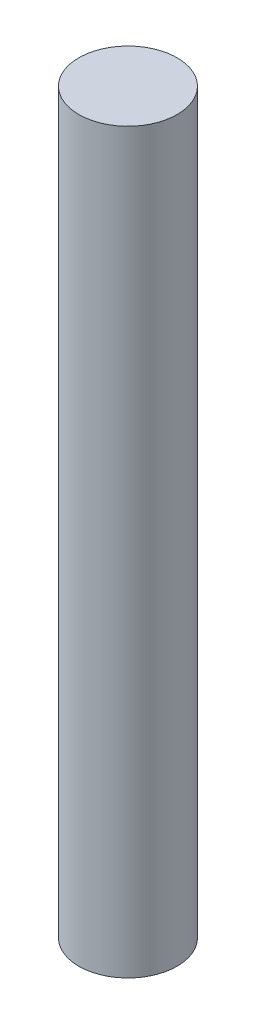
ISO-10303-21;
HEADER;
FILE_DESCRIPTION(('STEP AP214'),'2;1');
FILE_NAME('part.step','',(''),(''),'','','');
FILE_SCHEMA(('AUTOMOTIVE_DESIGN { 1 0 10303 214 1 1 1 1 }'));
ENDSEC;
DATA;
#1=APPLICATION_CONTEXT('core data for automotive mechanical design processes');
#2=APPLICATION_PROTOCOL_DEFINITION('international standard','automotive_design',2000,#1);
#3=PRODUCT_CONTEXT('',#1,'mechanical');
#4=PRODUCT('Part','Part','',(#3));
#5=PRODUCT_RELATED_PRODUCT_CATEGORY('part','',(#4));
#6=PRODUCT_DEFINITION_FORMATION('','',#4);
#7=PRODUCT_DEFINITION_CONTEXT('part definition',#1,'design');
#8=PRODUCT_DEFINITION('design','',#6,#7);
#9=PRODUCT_DEFINITION_SHAPE('','',#8);
#10=(LENGTH_UNIT() NAMED_UNIT(*) SI_UNIT(.MILLI.,.METRE.));
#11=(NAMED_UNIT(*) PLANE_ANGLE_UNIT() SI_UNIT($,.RADIAN.));
#12=(NAMED_UNIT(*) SI_UNIT($,.STERADIAN.) SOLID_ANGLE_UNIT());
#13=UNCERTAINTY_MEASURE_WITH_UNIT(LENGTH_MEASURE(1.E-05),#10,'distance_accuracy_value','');
#14=(GEOMETRIC_REPRESENTATION_CONTEXT(3) GLOBAL_UNCERTAINTY_ASSIGNED_CONTEXT((#13)) GLOBAL_UNIT_ASSIGNED_CONTEXT((#10,
#11,#12)) REPRESENTATION_CONTEXT('',''));
#15=CARTESIAN_POINT('',(0.,0.,0.));
#16=DIRECTION('',(0.,0.,1.));
#17=DIRECTION('',(1.,0.,0.));
#18=AXIS2_PLACEMENT_3D('',#15,#16,#17);
#19=CARTESIAN_POINT('',(0.,131.25,0.));
#20=DIRECTION('',(0.,-1.,0.));
#21=DIRECTION('',(0.,0.,-1.));
#22=AXIS2_PLACEMENT_3D('',#19,#20,#21);
#23=CYLINDRICAL_SURFACE('',#22,7.5);
#24=CARTESIAN_POINT('',(0.,131.25,0.));
#25=DIRECTION('',(0.,1.,0.));
#26=DIRECTION('',(0.,0.,1.));
#27=AXIS2_PLACEMENT_3D('',#24,#25,#26);
#28=CIRCLE('',#27,7.5);
#29=CARTESIAN_POINT('',(0.,131.25,7.5));
#30=VERTEX_POINT('',#29);
#31=EDGE_CURVE('E12',#30,#30,#28,.T.);
#32=ORIENTED_EDGE('',*,*,#31,.F.);
#33=EDGE_LOOP('',(#32));
#34=FACE_BOUND('',#33,.T.);
#35=CARTESIAN_POINT('',(0.,18.75,0.));
#36=DIRECTION('',(0.,1.,0.));
#37=DIRECTION('',(0.,0.,1.));
#38=AXIS2_PLACEMENT_3D('',#35,#36,#37);
#39=CIRCLE('',#38,7.5);
#40=CARTESIAN_POINT('',(0.,18.75,7.5));
#41=VERTEX_POINT('',#40);
#42=EDGE_CURVE('E49',#41,#41,#39,.T.);
#43=ORIENTED_EDGE('',*,*,#42,.T.);
#44=EDGE_LOOP('',(#43));
#45=FACE_BOUND('',#44,.T.);
#46=ADVANCED_FACE('F50',(#34,#45),#23,.T.);
#47=CARTESIAN_POINT('',(0.,131.25,0.));
#48=DIRECTION('',(0.,1.,0.));
#49=DIRECTION('',(0.,0.,1.));
#50=AXIS2_PLACEMENT_3D('',#47,#48,#49);
#51=PLANE('',#50);
#52=ORIENTED_EDGE('',*,*,#31,.T.);
#53=EDGE_LOOP('',(#52));
#54=FACE_BOUND('',#53,.T.);
#55=ADVANCED_FACE('F65',(#54),#51,.T.);
#56=CARTESIAN_POINT('',(0.,18.75,0.));
#57=DIRECTION('',(0.,1.,0.));
#58=DIRECTION('',(0.,0.,1.));
#59=AXIS2_PLACEMENT_3D('',#56,#57,#58);
#60=PLANE('',#59);
#61=ORIENTED_EDGE('',*,*,#42,.F.);
#62=EDGE_LOOP('',(#61));
#63=FACE_BOUND('',#62,.T.);
#64=ADVANCED_FACE('F58',(#63),#60,.F.);
#65=CLOSED_SHELL('',(#46,#55,#64));
#66=MANIFOLD_SOLID_BREP('B2',#65);
#67=ADVANCED_BREP_SHAPE_REPRESENTATION('',(#18,#66),#14);
#68=SHAPE_DEFINITION_REPRESENTATION(#9,#67);
ENDSEC;
END-ISO-10303-21;
